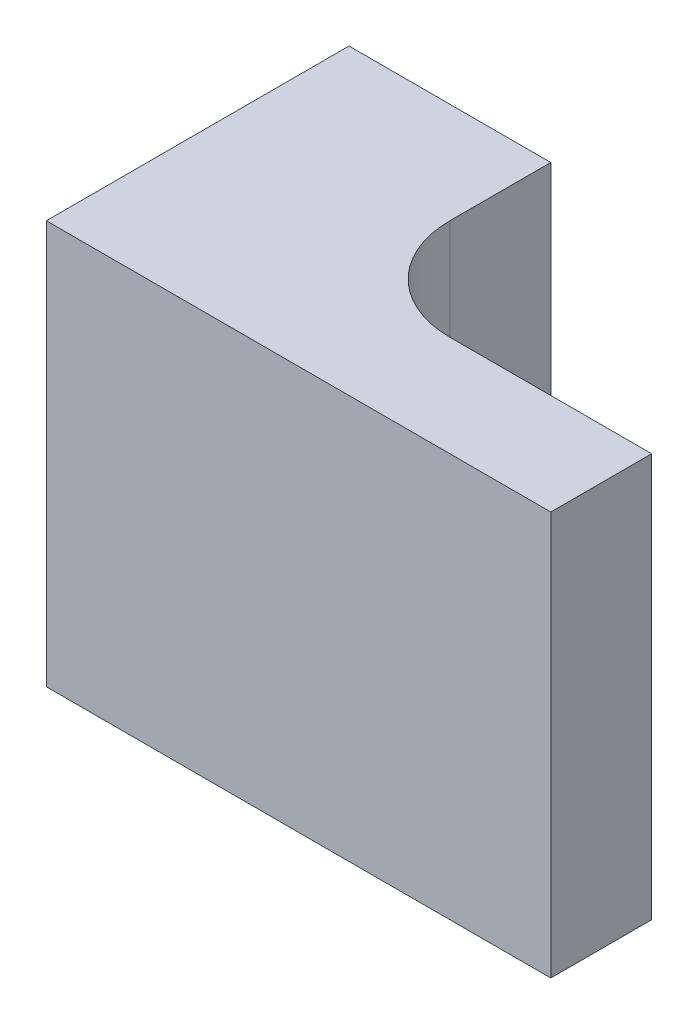
ISO-10303-21;
HEADER;
FILE_DESCRIPTION(('STEP AP214'),'2;1');
FILE_NAME('part.step','',(''),(''),'','','');
FILE_SCHEMA(('AUTOMOTIVE_DESIGN { 1 0 10303 214 1 1 1 1 }'));
ENDSEC;
DATA;
#1=APPLICATION_CONTEXT('core data for automotive mechanical design processes');
#2=APPLICATION_PROTOCOL_DEFINITION('international standard','automotive_design',2000,#1);
#3=PRODUCT_CONTEXT('',#1,'mechanical');
#4=PRODUCT('Part','Part','',(#3));
#5=PRODUCT_RELATED_PRODUCT_CATEGORY('part','',(#4));
#6=PRODUCT_DEFINITION_FORMATION('','',#4);
#7=PRODUCT_DEFINITION_CONTEXT('part definition',#1,'design');
#8=PRODUCT_DEFINITION('design','',#6,#7);
#9=PRODUCT_DEFINITION_SHAPE('','',#8);
#10=(LENGTH_UNIT() NAMED_UNIT(*) SI_UNIT(.MILLI.,.METRE.));
#11=(NAMED_UNIT(*) PLANE_ANGLE_UNIT() SI_UNIT($,.RADIAN.));
#12=(NAMED_UNIT(*) SI_UNIT($,.STERADIAN.) SOLID_ANGLE_UNIT());
#13=UNCERTAINTY_MEASURE_WITH_UNIT(LENGTH_MEASURE(1.E-05),#10,'distance_accuracy_value','');
#14=(GEOMETRIC_REPRESENTATION_CONTEXT(3) GLOBAL_UNCERTAINTY_ASSIGNED_CONTEXT((#13)) GLOBAL_UNIT_ASSIGNED_CONTEXT((#10,
#11,#12)) REPRESENTATION_CONTEXT('',''));
#15=CARTESIAN_POINT('',(0.,0.,0.));
#16=DIRECTION('',(0.,0.,1.));
#17=DIRECTION('',(1.,0.,0.));
#18=AXIS2_PLACEMENT_3D('',#15,#16,#17);
#19=CARTESIAN_POINT('',(-10.,20.,0.));
#20=DIRECTION('',(0.,0.,1.));
#21=DIRECTION('',(1.,0.,0.));
#22=AXIS2_PLACEMENT_3D('',#19,#20,#21);
#23=PLANE('',#22);
#24=DIRECTION('',(-1.,0.,0.));
#25=VECTOR('',#24,1.);
#26=CARTESIAN_POINT('',(-10.,0.,0.));
#27=LINE('',#26,#25);
#28=CARTESIAN_POINT('',(0.,0.,0.));
#29=VERTEX_POINT('',#28);
#30=CARTESIAN_POINT('',(-10.,0.,0.));
#31=VERTEX_POINT('',#30);
#32=EDGE_CURVE('E134',#29,#31,#27,.T.);
#33=ORIENTED_EDGE('',*,*,#32,.T.);
#34=DIRECTION('',(0.,-1.,0.));
#35=VECTOR('',#34,1.);
#36=CARTESIAN_POINT('',(-10.,20.,0.));
#37=LINE('',#36,#35);
#38=CARTESIAN_POINT('',(-10.,20.,0.));
#39=VERTEX_POINT('',#38);
#40=EDGE_CURVE('E11',#39,#31,#37,.T.);
#41=ORIENTED_EDGE('',*,*,#40,.F.);
#42=DIRECTION('',(-1.,0.,0.));
#43=VECTOR('',#42,1.);
#44=CARTESIAN_POINT('',(-10.,20.,0.));
#45=LINE('',#44,#43);
#46=CARTESIAN_POINT('',(0.,20.,0.));
#47=VERTEX_POINT('',#46);
#48=EDGE_CURVE('E153',#47,#39,#45,.T.);
#49=ORIENTED_EDGE('',*,*,#48,.F.);
#50=DIRECTION('',(0.,-1.,0.));
#51=VECTOR('',#50,1.);
#52=CARTESIAN_POINT('',(0.,20.,0.));
#53=LINE('',#52,#51);
#54=EDGE_CURVE('E130',#47,#29,#53,.T.);
#55=ORIENTED_EDGE('',*,*,#54,.T.);
#56=EDGE_LOOP('',(#33,#41,#49,#55));
#57=FACE_BOUND('',#56,.T.);
#58=ADVANCED_FACE('F39',(#57),#23,.F.);
#59=CARTESIAN_POINT('',(-10.,20.,15.));
#60=DIRECTION('',(1.,0.,0.));
#61=DIRECTION('',(0.,0.,-1.));
#62=AXIS2_PLACEMENT_3D('',#59,#60,#61);
#63=PLANE('',#62);
#64=DIRECTION('',(0.,0.,1.));
#65=VECTOR('',#64,1.);
#66=CARTESIAN_POINT('',(-10.,0.,15.));
#67=LINE('',#66,#65);
#68=CARTESIAN_POINT('',(-10.,0.,15.));
#69=VERTEX_POINT('',#68);
#70=EDGE_CURVE('E138',#31,#69,#67,.T.);
#71=ORIENTED_EDGE('',*,*,#70,.T.);
#72=DIRECTION('',(0.,-1.,0.));
#73=VECTOR('',#72,1.);
#74=CARTESIAN_POINT('',(-10.,20.,15.));
#75=LINE('',#74,#73);
#76=CARTESIAN_POINT('',(-10.,20.,15.));
#77=VERTEX_POINT('',#76);
#78=EDGE_CURVE('E48',#77,#69,#75,.T.);
#79=ORIENTED_EDGE('',*,*,#78,.F.);
#80=DIRECTION('',(0.,0.,1.));
#81=VECTOR('',#80,1.);
#82=CARTESIAN_POINT('',(-10.,20.,15.));
#83=LINE('',#82,#81);
#84=EDGE_CURVE('E96',#39,#77,#83,.T.);
#85=ORIENTED_EDGE('',*,*,#84,.F.);
#86=ORIENTED_EDGE('',*,*,#40,.T.);
#87=EDGE_LOOP('',(#71,#79,#85,#86));
#88=FACE_BOUND('',#87,.T.);
#89=ADVANCED_FACE('F187',(#88),#63,.F.);
#90=CARTESIAN_POINT('',(15.,20.,15.));
#91=DIRECTION('',(0.,0.,-1.));
#92=DIRECTION('',(-1.,0.,0.));
#93=AXIS2_PLACEMENT_3D('',#90,#91,#92);
#94=PLANE('',#93);
#95=DIRECTION('',(1.,0.,0.));
#96=VECTOR('',#95,1.);
#97=CARTESIAN_POINT('',(15.,0.,15.));
#98=LINE('',#97,#96);
#99=CARTESIAN_POINT('',(15.,0.,15.));
#100=VERTEX_POINT('',#99);
#101=EDGE_CURVE('E141',#69,#100,#98,.T.);
#102=ORIENTED_EDGE('',*,*,#101,.T.);
#103=DIRECTION('',(0.,-1.,0.));
#104=VECTOR('',#103,1.);
#105=CARTESIAN_POINT('',(15.,20.,15.));
#106=LINE('',#105,#104);
#107=CARTESIAN_POINT('',(15.,20.,15.));
#108=VERTEX_POINT('',#107);
#109=EDGE_CURVE('E160',#108,#100,#106,.T.);
#110=ORIENTED_EDGE('',*,*,#109,.F.);
#111=DIRECTION('',(1.,0.,0.));
#112=VECTOR('',#111,1.);
#113=CARTESIAN_POINT('',(15.,20.,15.));
#114=LINE('',#113,#112);
#115=EDGE_CURVE('E170',#77,#108,#114,.T.);
#116=ORIENTED_EDGE('',*,*,#115,.F.);
#117=ORIENTED_EDGE('',*,*,#78,.T.);
#118=EDGE_LOOP('',(#102,#110,#116,#117));
#119=FACE_BOUND('',#118,.T.);
#120=ADVANCED_FACE('F168',(#119),#94,.F.);
#121=CARTESIAN_POINT('',(15.,20.,10.));
#122=DIRECTION('',(-1.,0.,0.));
#123=DIRECTION('',(0.,0.,1.));
#124=AXIS2_PLACEMENT_3D('',#121,#122,#123);
#125=PLANE('',#124);
#126=DIRECTION('',(0.,0.,-1.));
#127=VECTOR('',#126,1.);
#128=CARTESIAN_POINT('',(15.,0.,10.));
#129=LINE('',#128,#127);
#130=CARTESIAN_POINT('',(15.,0.,10.));
#131=VERTEX_POINT('',#130);
#132=EDGE_CURVE('E144',#100,#131,#129,.T.);
#133=ORIENTED_EDGE('',*,*,#132,.T.);
#134=DIRECTION('',(0.,-1.,0.));
#135=VECTOR('',#134,1.);
#136=CARTESIAN_POINT('',(15.,20.,10.));
#137=LINE('',#136,#135);
#138=CARTESIAN_POINT('',(15.,20.,10.));
#139=VERTEX_POINT('',#138);
#140=EDGE_CURVE('E123',#139,#131,#137,.T.);
#141=ORIENTED_EDGE('',*,*,#140,.F.);
#142=DIRECTION('',(0.,0.,-1.));
#143=VECTOR('',#142,1.);
#144=CARTESIAN_POINT('',(15.,20.,10.));
#145=LINE('',#144,#143);
#146=EDGE_CURVE('E112',#108,#139,#145,.T.);
#147=ORIENTED_EDGE('',*,*,#146,.F.);
#148=ORIENTED_EDGE('',*,*,#109,.T.);
#149=EDGE_LOOP('',(#133,#141,#147,#148));
#150=FACE_BOUND('',#149,.T.);
#151=ADVANCED_FACE('F176',(#150),#125,.F.);
#152=CARTESIAN_POINT('',(5.,20.,10.));
#153=DIRECTION('',(0.,0.,1.));
#154=DIRECTION('',(1.,0.,0.));
#155=AXIS2_PLACEMENT_3D('',#152,#153,#154);
#156=PLANE('',#155);
#157=DIRECTION('',(-1.,0.,0.));
#158=VECTOR('',#157,1.);
#159=CARTESIAN_POINT('',(5.,0.,10.));
#160=LINE('',#159,#158);
#161=CARTESIAN_POINT('',(5.,0.,10.));
#162=VERTEX_POINT('',#161);
#163=EDGE_CURVE('E121',#131,#162,#160,.T.);
#164=ORIENTED_EDGE('',*,*,#163,.T.);
#165=DIRECTION('',(0.,-1.,0.));
#166=VECTOR('',#165,1.);
#167=CARTESIAN_POINT('',(5.,20.,10.));
#168=LINE('',#167,#166);
#169=CARTESIAN_POINT('',(5.,20.,10.));
#170=VERTEX_POINT('',#169);
#171=EDGE_CURVE('E118',#170,#162,#168,.T.);
#172=ORIENTED_EDGE('',*,*,#171,.F.);
#173=DIRECTION('',(-1.,0.,0.));
#174=VECTOR('',#173,1.);
#175=CARTESIAN_POINT('',(5.,20.,10.));
#176=LINE('',#175,#174);
#177=EDGE_CURVE('E106',#139,#170,#176,.T.);
#178=ORIENTED_EDGE('',*,*,#177,.F.);
#179=ORIENTED_EDGE('',*,*,#140,.T.);
#180=EDGE_LOOP('',(#164,#172,#178,#179));
#181=FACE_BOUND('',#180,.T.);
#182=ADVANCED_FACE('F119',(#181),#156,.F.);
#183=CARTESIAN_POINT('',(5.,20.,5.));
#184=DIRECTION('',(0.,-1.,0.));
#185=DIRECTION('',(0.,0.,-1.));
#186=AXIS2_PLACEMENT_3D('',#183,#184,#185);
#187=CYLINDRICAL_SURFACE('',#186,5.);
#188=CARTESIAN_POINT('',(5.,0.,5.));
#189=DIRECTION('',(0.,-1.,0.));
#190=DIRECTION('',(0.,0.,1.));
#191=AXIS2_PLACEMENT_3D('',#188,#189,#190);
#192=CIRCLE('',#191,5.);
#193=CARTESIAN_POINT('',(0.,0.,5.));
#194=VERTEX_POINT('',#193);
#195=EDGE_CURVE('E82',#162,#194,#192,.T.);
#196=ORIENTED_EDGE('',*,*,#195,.T.);
#197=DIRECTION('',(0.,-1.,0.));
#198=VECTOR('',#197,1.);
#199=CARTESIAN_POINT('',(0.,20.,5.));
#200=LINE('',#199,#198);
#201=CARTESIAN_POINT('',(0.,20.,5.));
#202=VERTEX_POINT('',#201);
#203=EDGE_CURVE('E124',#202,#194,#200,.T.);
#204=ORIENTED_EDGE('',*,*,#203,.F.);
#205=CARTESIAN_POINT('',(5.,20.,5.));
#206=DIRECTION('',(0.,-1.,0.));
#207=DIRECTION('',(0.,0.,1.));
#208=AXIS2_PLACEMENT_3D('',#205,#206,#207);
#209=CIRCLE('',#208,5.);
#210=EDGE_CURVE('E110',#170,#202,#209,.T.);
#211=ORIENTED_EDGE('',*,*,#210,.F.);
#212=ORIENTED_EDGE('',*,*,#171,.T.);
#213=EDGE_LOOP('',(#196,#204,#211,#212));
#214=FACE_BOUND('',#213,.T.);
#215=ADVANCED_FACE('F126',(#214),#187,.F.);
#216=CARTESIAN_POINT('',(0.,20.,0.));
#217=DIRECTION('',(-1.,0.,0.));
#218=DIRECTION('',(0.,0.,1.));
#219=AXIS2_PLACEMENT_3D('',#216,#217,#218);
#220=PLANE('',#219);
#221=DIRECTION('',(0.,0.,-1.));
#222=VECTOR('',#221,1.);
#223=CARTESIAN_POINT('',(0.,0.,0.));
#224=LINE('',#223,#222);
#225=EDGE_CURVE('E88',#194,#29,#224,.T.);
#226=ORIENTED_EDGE('',*,*,#225,.T.);
#227=ORIENTED_EDGE('',*,*,#54,.F.);
#228=DIRECTION('',(0.,0.,-1.));
#229=VECTOR('',#228,1.);
#230=CARTESIAN_POINT('',(0.,20.,0.));
#231=LINE('',#230,#229);
#232=EDGE_CURVE('E56',#202,#47,#231,.T.);
#233=ORIENTED_EDGE('',*,*,#232,.F.);
#234=ORIENTED_EDGE('',*,*,#203,.T.);
#235=EDGE_LOOP('',(#226,#227,#233,#234));
#236=FACE_BOUND('',#235,.T.);
#237=ADVANCED_FACE('F201',(#236),#220,.F.);
#238=CARTESIAN_POINT('',(5.,20.,5.));
#239=DIRECTION('',(0.,1.,0.));
#240=DIRECTION('',(0.,0.,1.));
#241=AXIS2_PLACEMENT_3D('',#238,#239,#240);
#242=PLANE('',#241);
#243=ORIENTED_EDGE('',*,*,#48,.T.);
#244=ORIENTED_EDGE('',*,*,#84,.T.);
#245=ORIENTED_EDGE('',*,*,#115,.T.);
#246=ORIENTED_EDGE('',*,*,#146,.T.);
#247=ORIENTED_EDGE('',*,*,#177,.T.);
#248=ORIENTED_EDGE('',*,*,#210,.T.);
#249=ORIENTED_EDGE('',*,*,#232,.T.);
#250=EDGE_LOOP('',(#243,#244,#245,#246,#247,#248,#249));
#251=FACE_BOUND('',#250,.T.);
#252=ADVANCED_FACE('F108',(#251),#242,.T.);
#253=CARTESIAN_POINT('',(5.,0.,5.));
#254=DIRECTION('',(0.,1.,0.));
#255=DIRECTION('',(0.,0.,1.));
#256=AXIS2_PLACEMENT_3D('',#253,#254,#255);
#257=PLANE('',#256);
#258=ORIENTED_EDGE('',*,*,#32,.F.);
#259=ORIENTED_EDGE('',*,*,#225,.F.);
#260=ORIENTED_EDGE('',*,*,#195,.F.);
#261=ORIENTED_EDGE('',*,*,#163,.F.);
#262=ORIENTED_EDGE('',*,*,#132,.F.);
#263=ORIENTED_EDGE('',*,*,#101,.F.);
#264=ORIENTED_EDGE('',*,*,#70,.F.);
#265=EDGE_LOOP('',(#258,#259,#260,#261,#262,#263,#264));
#266=FACE_BOUND('',#265,.T.);
#267=ADVANCED_FACE('F174',(#266),#257,.F.);
#268=CLOSED_SHELL('',(#58,#89,#120,#151,#182,#215,#237,#252,#267));
#269=MANIFOLD_SOLID_BREP('B2',#268);
#270=ADVANCED_BREP_SHAPE_REPRESENTATION('',(#18,#269),#14);
#271=SHAPE_DEFINITION_REPRESENTATION(#9,#270);
ENDSEC;
END-ISO-10303-21;
